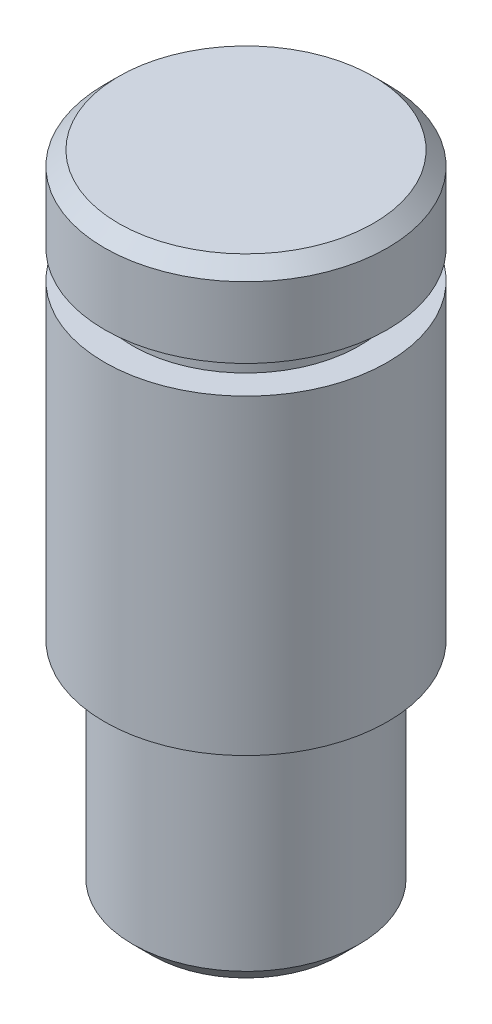
ISO-10303-21;
HEADER;
FILE_DESCRIPTION(('STEP AP214'),'2;1');
FILE_NAME('part.step','',(''),(''),'','','');
FILE_SCHEMA(('AUTOMOTIVE_DESIGN { 1 0 10303 214 1 1 1 1 }'));
ENDSEC;
DATA;
#1=APPLICATION_CONTEXT('core data for automotive mechanical design processes');
#2=APPLICATION_PROTOCOL_DEFINITION('international standard','automotive_design',2000,#1);
#3=PRODUCT_CONTEXT('',#1,'mechanical');
#4=PRODUCT('Part','Part','',(#3));
#5=PRODUCT_RELATED_PRODUCT_CATEGORY('part','',(#4));
#6=PRODUCT_DEFINITION_FORMATION('','',#4);
#7=PRODUCT_DEFINITION_CONTEXT('part definition',#1,'design');
#8=PRODUCT_DEFINITION('design','',#6,#7);
#9=PRODUCT_DEFINITION_SHAPE('','',#8);
#10=(LENGTH_UNIT() NAMED_UNIT(*) SI_UNIT(.MILLI.,.METRE.));
#11=(NAMED_UNIT(*) PLANE_ANGLE_UNIT() SI_UNIT($,.RADIAN.));
#12=(NAMED_UNIT(*) SI_UNIT($,.STERADIAN.) SOLID_ANGLE_UNIT());
#13=UNCERTAINTY_MEASURE_WITH_UNIT(LENGTH_MEASURE(1.E-05),#10,'distance_accuracy_value','');
#14=(GEOMETRIC_REPRESENTATION_CONTEXT(3) GLOBAL_UNCERTAINTY_ASSIGNED_CONTEXT((#13)) GLOBAL_UNIT_ASSIGNED_CONTEXT((#10,
#11,#12)) REPRESENTATION_CONTEXT('',''));
#15=CARTESIAN_POINT('',(0.,0.,0.));
#16=DIRECTION('',(0.,0.,1.));
#17=DIRECTION('',(1.,0.,0.));
#18=AXIS2_PLACEMENT_3D('',#15,#16,#17);
#19=CARTESIAN_POINT('',(0.,23.,0.));
#20=DIRECTION('',(0.,-1.,0.));
#21=DIRECTION('',(0.,0.,-1.));
#22=AXIS2_PLACEMENT_3D('',#19,#20,#21);
#23=CYLINDRICAL_SURFACE('',#22,5.);
#24=CARTESIAN_POINT('',(0.,20.,0.));
#25=DIRECTION('',(0.,1.,0.));
#26=DIRECTION('',(0.,0.,1.));
#27=AXIS2_PLACEMENT_3D('',#24,#25,#26);
#28=CIRCLE('',#27,5.);
#29=CARTESIAN_POINT('',(0.,20.,5.));
#30=VERTEX_POINT('',#29);
#31=EDGE_CURVE('E61',#30,#30,#28,.T.);
#32=ORIENTED_EDGE('',*,*,#31,.T.);
#33=EDGE_LOOP('',(#32));
#34=FACE_BOUND('',#33,.T.);
#35=CARTESIAN_POINT('',(0.,22.5,0.));
#36=DIRECTION('',(0.,1.,0.));
#37=DIRECTION('',(0.,0.,1.));
#38=AXIS2_PLACEMENT_3D('',#35,#36,#37);
#39=CIRCLE('',#38,5.);
#40=CARTESIAN_POINT('',(0.,22.5,5.));
#41=VERTEX_POINT('',#40);
#42=EDGE_CURVE('E10',#41,#41,#39,.F.);
#43=ORIENTED_EDGE('',*,*,#42,.T.);
#44=EDGE_LOOP('',(#43));
#45=FACE_BOUND('',#44,.T.);
#46=ADVANCED_FACE('F42',(#34,#45),#23,.T.);
#47=CARTESIAN_POINT('',(0.,23.,0.));
#48=DIRECTION('',(0.,1.,0.));
#49=DIRECTION('',(0.,0.,1.));
#50=AXIS2_PLACEMENT_3D('',#47,#48,#49);
#51=PLANE('',#50);
#52=CARTESIAN_POINT('',(0.,23.,0.));
#53=DIRECTION('',(0.,1.,0.));
#54=DIRECTION('',(0.,0.,1.));
#55=AXIS2_PLACEMENT_3D('',#52,#53,#54);
#56=CIRCLE('',#55,4.5);
#57=CARTESIAN_POINT('',(0.,23.,4.5));
#58=VERTEX_POINT('',#57);
#59=EDGE_CURVE('E52',#58,#58,#56,.T.);
#60=ORIENTED_EDGE('',*,*,#59,.T.);
#61=EDGE_LOOP('',(#60));
#62=FACE_BOUND('',#61,.T.);
#63=ADVANCED_FACE('F114',(#62),#51,.T.);
#64=CARTESIAN_POINT('',(0.,23.,0.));
#65=DIRECTION('',(0.,-1.,0.));
#66=DIRECTION('',(0.,0.,-1.));
#67=AXIS2_PLACEMENT_3D('',#64,#65,#66);
#68=CONICAL_SURFACE('',#67,4.5,0.785398163397447);
#69=ORIENTED_EDGE('',*,*,#42,.F.);
#70=EDGE_LOOP('',(#69));
#71=FACE_BOUND('',#70,.T.);
#72=ORIENTED_EDGE('',*,*,#59,.F.);
#73=EDGE_LOOP('',(#72));
#74=FACE_BOUND('',#73,.T.);
#75=ADVANCED_FACE('F45',(#71,#74),#68,.T.);
#76=CARTESIAN_POINT('',(0.,19.,0.));
#77=DIRECTION('',(0.,1.,0.));
#78=DIRECTION('',(0.,0.,1.));
#79=AXIS2_PLACEMENT_3D('',#76,#77,#78);
#80=PLANE('',#79);
#81=CARTESIAN_POINT('',(0.,19.,0.));
#82=DIRECTION('',(0.,1.,0.));
#83=DIRECTION('',(0.,0.,1.));
#84=AXIS2_PLACEMENT_3D('',#81,#82,#83);
#85=CIRCLE('',#84,4.);
#86=CARTESIAN_POINT('',(0.,19.,4.));
#87=VERTEX_POINT('',#86);
#88=EDGE_CURVE('E64',#87,#87,#85,.T.);
#89=ORIENTED_EDGE('',*,*,#88,.F.);
#90=EDGE_LOOP('',(#89));
#91=FACE_BOUND('',#90,.T.);
#92=CARTESIAN_POINT('',(0.,19.,0.));
#93=DIRECTION('',(0.,1.,0.));
#94=DIRECTION('',(0.,0.,1.));
#95=AXIS2_PLACEMENT_3D('',#92,#93,#94);
#96=CIRCLE('',#95,5.);
#97=CARTESIAN_POINT('',(0.,19.,5.));
#98=VERTEX_POINT('',#97);
#99=EDGE_CURVE('E47',#98,#98,#96,.T.);
#100=ORIENTED_EDGE('',*,*,#99,.T.);
#101=EDGE_LOOP('',(#100));
#102=FACE_BOUND('',#101,.T.);
#103=ADVANCED_FACE('F135',(#91,#102),#80,.T.);
#104=CARTESIAN_POINT('',(0.,20.,0.));
#105=DIRECTION('',(0.,1.,0.));
#106=DIRECTION('',(0.,0.,1.));
#107=AXIS2_PLACEMENT_3D('',#104,#105,#106);
#108=PLANE('',#107);
#109=CARTESIAN_POINT('',(0.,20.,0.));
#110=DIRECTION('',(0.,1.,0.));
#111=DIRECTION('',(0.,0.,1.));
#112=AXIS2_PLACEMENT_3D('',#109,#110,#111);
#113=CIRCLE('',#112,4.);
#114=CARTESIAN_POINT('',(0.,20.,4.));
#115=VERTEX_POINT('',#114);
#116=EDGE_CURVE('E74',#115,#115,#113,.T.);
#117=ORIENTED_EDGE('',*,*,#116,.T.);
#118=EDGE_LOOP('',(#117));
#119=FACE_BOUND('',#118,.T.);
#120=ORIENTED_EDGE('',*,*,#31,.F.);
#121=EDGE_LOOP('',(#120));
#122=FACE_BOUND('',#121,.T.);
#123=ADVANCED_FACE('F129',(#119,#122),#108,.F.);
#124=CARTESIAN_POINT('',(0.,19.,0.));
#125=DIRECTION('',(0.,1.,0.));
#126=DIRECTION('',(0.,0.,1.));
#127=AXIS2_PLACEMENT_3D('',#124,#125,#126);
#128=CYLINDRICAL_SURFACE('',#127,4.);
#129=ORIENTED_EDGE('',*,*,#88,.T.);
#130=EDGE_LOOP('',(#129));
#131=FACE_BOUND('',#130,.T.);
#132=ORIENTED_EDGE('',*,*,#116,.F.);
#133=EDGE_LOOP('',(#132));
#134=FACE_BOUND('',#133,.T.);
#135=ADVANCED_FACE('F121',(#131,#134),#128,.T.);
#136=CARTESIAN_POINT('',(0.,8.,0.));
#137=DIRECTION('',(0.,1.,0.));
#138=DIRECTION('',(0.,0.,1.));
#139=AXIS2_PLACEMENT_3D('',#136,#137,#138);
#140=CIRCLE('',#139,5.);
#141=CARTESIAN_POINT('',(0.,8.,5.));
#142=VERTEX_POINT('',#141);
#143=EDGE_CURVE('E84',#142,#142,#140,.T.);
#144=ORIENTED_EDGE('',*,*,#143,.T.);
#145=EDGE_LOOP('',(#144));
#146=FACE_BOUND('',#145,.T.);
#147=ORIENTED_EDGE('',*,*,#99,.F.);
#148=EDGE_LOOP('',(#147));
#149=FACE_BOUND('',#148,.T.);
#150=ADVANCED_FACE('F115',(#146,#149),#23,.T.);
#151=CARTESIAN_POINT('',(0.,0.,0.));
#152=DIRECTION('',(0.,1.,0.));
#153=DIRECTION('',(0.,0.,1.));
#154=AXIS2_PLACEMENT_3D('',#151,#152,#153);
#155=CYLINDRICAL_SURFACE('',#154,4.);
#156=CARTESIAN_POINT('',(0.,8.,0.));
#157=DIRECTION('',(0.,1.,0.));
#158=DIRECTION('',(0.,0.,1.));
#159=AXIS2_PLACEMENT_3D('',#156,#157,#158);
#160=CIRCLE('',#159,4.);
#161=CARTESIAN_POINT('',(0.,8.,4.));
#162=VERTEX_POINT('',#161);
#163=EDGE_CURVE('E80',#162,#162,#160,.T.);
#164=ORIENTED_EDGE('',*,*,#163,.F.);
#165=EDGE_LOOP('',(#164));
#166=FACE_BOUND('',#165,.T.);
#167=CARTESIAN_POINT('',(0.,0.690499999999985,0.));
#168=DIRECTION('',(0.,1.,0.));
#169=DIRECTION('',(0.,0.,1.));
#170=AXIS2_PLACEMENT_3D('',#167,#168,#169);
#171=CIRCLE('',#170,3.99999999999999);
#172=CARTESIAN_POINT('',(0.,0.690499999999985,3.99999999999999));
#173=VERTEX_POINT('',#172);
#174=EDGE_CURVE('E92',#173,#173,#171,.T.);
#175=ORIENTED_EDGE('',*,*,#174,.T.);
#176=EDGE_LOOP('',(#175));
#177=FACE_BOUND('',#176,.T.);
#178=ADVANCED_FACE('F98',(#166,#177),#155,.T.);
#179=CARTESIAN_POINT('',(4.,8.,0.));
#180=DIRECTION('',(0.,1.,0.));
#181=DIRECTION('',(0.,0.,1.));
#182=AXIS2_PLACEMENT_3D('',#179,#180,#181);
#183=PLANE('',#182);
#184=ORIENTED_EDGE('',*,*,#143,.F.);
#185=EDGE_LOOP('',(#184));
#186=FACE_BOUND('',#185,.T.);
#187=ORIENTED_EDGE('',*,*,#163,.T.);
#188=EDGE_LOOP('',(#187));
#189=FACE_BOUND('',#188,.T.);
#190=ADVANCED_FACE('F104',(#186,#189),#183,.F.);
#191=CARTESIAN_POINT('',(0.,0.,0.));
#192=DIRECTION('',(0.,1.,0.));
#193=DIRECTION('',(0.,0.,1.));
#194=AXIS2_PLACEMENT_3D('',#191,#192,#193);
#195=CONICAL_SURFACE('',#194,3.3095,0.785398163397455);
#196=ORIENTED_EDGE('',*,*,#174,.F.);
#197=EDGE_LOOP('',(#196));
#198=FACE_BOUND('',#197,.T.);
#199=CARTESIAN_POINT('',(0.,0.,0.));
#200=DIRECTION('',(0.,1.,0.));
#201=DIRECTION('',(0.,0.,1.));
#202=AXIS2_PLACEMENT_3D('',#199,#200,#201);
#203=CIRCLE('',#202,3.3095);
#204=CARTESIAN_POINT('',(0.,0.,3.3095));
#205=VERTEX_POINT('',#204);
#206=EDGE_CURVE('E88',#205,#205,#203,.T.);
#207=ORIENTED_EDGE('',*,*,#206,.T.);
#208=EDGE_LOOP('',(#207));
#209=FACE_BOUND('',#208,.T.);
#210=ADVANCED_FACE('F100',(#198,#209),#195,.T.);
#211=CARTESIAN_POINT('',(0.,0.,0.));
#212=DIRECTION('',(0.,1.,0.));
#213=DIRECTION('',(0.,0.,1.));
#214=AXIS2_PLACEMENT_3D('',#211,#212,#213);
#215=PLANE('',#214);
#216=ORIENTED_EDGE('',*,*,#206,.F.);
#217=EDGE_LOOP('',(#216));
#218=FACE_BOUND('',#217,.T.);
#219=ADVANCED_FACE('F103',(#218),#215,.F.);
#220=CLOSED_SHELL('',(#46,#63,#75,#103,#123,#135,#150,#178,#190,#210,#219));
#221=MANIFOLD_SOLID_BREP('B2',#220);
#222=ADVANCED_BREP_SHAPE_REPRESENTATION('',(#18,#221),#14);
#223=SHAPE_DEFINITION_REPRESENTATION(#9,#222);
ENDSEC;
END-ISO-10303-21;
